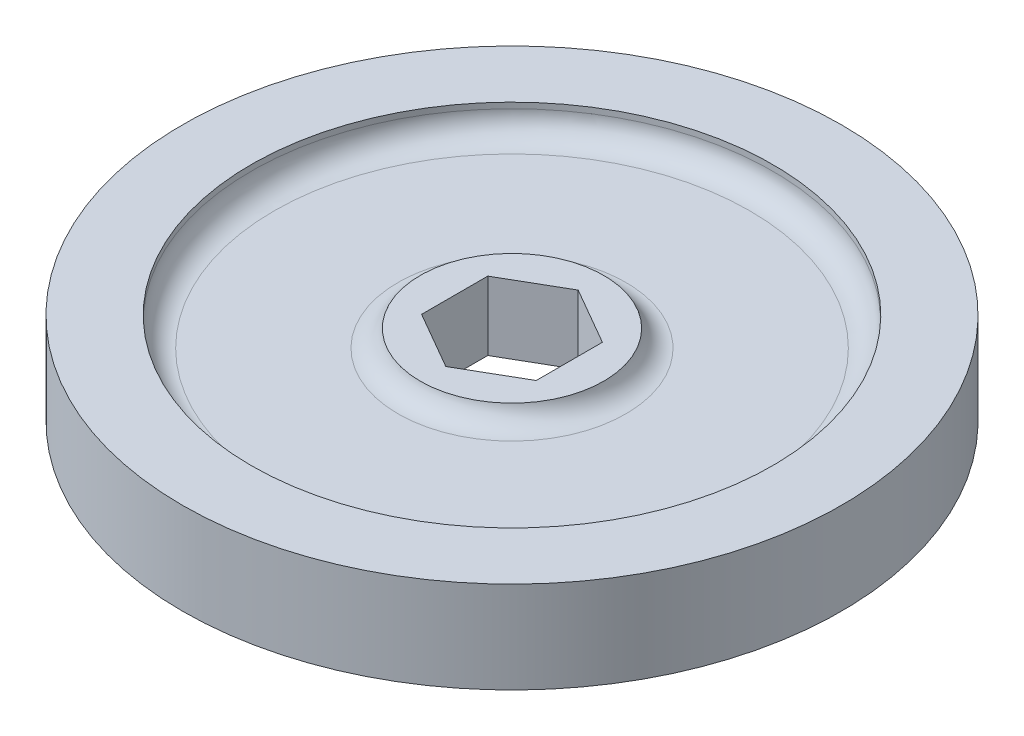
ISO-10303-21;
HEADER;
FILE_DESCRIPTION(('STEP AP214'),'2;1');
FILE_NAME('part.step','',(''),(''),'','','');
FILE_SCHEMA(('AUTOMOTIVE_DESIGN { 1 0 10303 214 1 1 1 1 }'));
ENDSEC;
DATA;
#1=APPLICATION_CONTEXT('core data for automotive mechanical design processes');
#2=APPLICATION_PROTOCOL_DEFINITION('international standard','automotive_design',2000,#1);
#3=PRODUCT_CONTEXT('',#1,'mechanical');
#4=PRODUCT('Part','Part','',(#3));
#5=PRODUCT_RELATED_PRODUCT_CATEGORY('part','',(#4));
#6=PRODUCT_DEFINITION_FORMATION('','',#4);
#7=PRODUCT_DEFINITION_CONTEXT('part definition',#1,'design');
#8=PRODUCT_DEFINITION('design','',#6,#7);
#9=PRODUCT_DEFINITION_SHAPE('','',#8);
#10=(LENGTH_UNIT() NAMED_UNIT(*) SI_UNIT(.MILLI.,.METRE.));
#11=(NAMED_UNIT(*) PLANE_ANGLE_UNIT() SI_UNIT($,.RADIAN.));
#12=(NAMED_UNIT(*) SI_UNIT($,.STERADIAN.) SOLID_ANGLE_UNIT());
#13=UNCERTAINTY_MEASURE_WITH_UNIT(LENGTH_MEASURE(1.E-05),#10,'distance_accuracy_value','');
#14=(GEOMETRIC_REPRESENTATION_CONTEXT(3) GLOBAL_UNCERTAINTY_ASSIGNED_CONTEXT((#13)) GLOBAL_UNIT_ASSIGNED_CONTEXT((#10,
#11,#12)) REPRESENTATION_CONTEXT('',''));
#15=CARTESIAN_POINT('',(0.,0.,0.));
#16=DIRECTION('',(0.,0.,1.));
#17=DIRECTION('',(1.,0.,0.));
#18=AXIS2_PLACEMENT_3D('',#15,#16,#17);
#19=CARTESIAN_POINT('',(3.175,-3.81,-5.49926131403118));
#20=DIRECTION('',(0.5,0.,-0.866025403784439));
#21=DIRECTION('',(-0.866025403784439,0.,-0.5));
#22=AXIS2_PLACEMENT_3D('',#19,#20,#21);
#23=PLANE('',#22);
#24=DIRECTION('',(0.,1.,0.));
#25=VECTOR('',#24,1.);
#26=CARTESIAN_POINT('',(6.34999999999999,-3.81,-3.66617420935413));
#27=LINE('',#26,#25);
#28=CARTESIAN_POINT('',(6.34999999999999,-3.81,-3.66617420935413));
#29=VERTEX_POINT('',#28);
#30=CARTESIAN_POINT('',(6.34999999999999,3.81,-3.66617420935413));
#31=VERTEX_POINT('',#30);
#32=EDGE_CURVE('E85',#29,#31,#27,.T.);
#33=ORIENTED_EDGE('',*,*,#32,.T.);
#34=DIRECTION('',(-0.866025403784439,0.,-0.5));
#35=VECTOR('',#34,1.);
#36=CARTESIAN_POINT('',(3.175,3.81,-5.49926131403118));
#37=LINE('',#36,#35);
#38=CARTESIAN_POINT('',(0.,3.81,-7.33234841870824));
#39=VERTEX_POINT('',#38);
#40=EDGE_CURVE('E88',#31,#39,#37,.T.);
#41=ORIENTED_EDGE('',*,*,#40,.T.);
#42=DIRECTION('',(0.,1.,0.));
#43=VECTOR('',#42,1.);
#44=CARTESIAN_POINT('',(0.,-3.81,-7.33234841870824));
#45=LINE('',#44,#43);
#46=CARTESIAN_POINT('',(0.,-3.81,-7.33234841870824));
#47=VERTEX_POINT('',#46);
#48=EDGE_CURVE('E138',#47,#39,#45,.T.);
#49=ORIENTED_EDGE('',*,*,#48,.F.);
#50=DIRECTION('',(-0.866025403784439,0.,-0.5));
#51=VECTOR('',#50,1.);
#52=CARTESIAN_POINT('',(3.175,-3.81,-5.49926131403118));
#53=LINE('',#52,#51);
#54=EDGE_CURVE('E90',#29,#47,#53,.T.);
#55=ORIENTED_EDGE('',*,*,#54,.F.);
#56=EDGE_LOOP('',(#33,#41,#49,#55));
#57=FACE_BOUND('',#56,.T.);
#58=ADVANCED_FACE('F34',(#57),#23,.F.);
#59=CARTESIAN_POINT('',(-3.175,-3.81,-5.49926131403118));
#60=DIRECTION('',(-0.5,0.,-0.866025403784439));
#61=DIRECTION('',(-0.866025403784439,0.,0.5));
#62=AXIS2_PLACEMENT_3D('',#59,#60,#61);
#63=PLANE('',#62);
#64=ORIENTED_EDGE('',*,*,#48,.T.);
#65=DIRECTION('',(-0.866025403784439,0.,0.5));
#66=VECTOR('',#65,1.);
#67=CARTESIAN_POINT('',(-3.175,3.81,-5.49926131403118));
#68=LINE('',#67,#66);
#69=CARTESIAN_POINT('',(-6.35,3.81,-3.66617420935412));
#70=VERTEX_POINT('',#69);
#71=EDGE_CURVE('E106',#39,#70,#68,.T.);
#72=ORIENTED_EDGE('',*,*,#71,.T.);
#73=DIRECTION('',(0.,1.,0.));
#74=VECTOR('',#73,1.);
#75=CARTESIAN_POINT('',(-6.35,-3.81,-3.66617420935412));
#76=LINE('',#75,#74);
#77=CARTESIAN_POINT('',(-6.35,-3.81,-3.66617420935412));
#78=VERTEX_POINT('',#77);
#79=EDGE_CURVE('E141',#78,#70,#76,.T.);
#80=ORIENTED_EDGE('',*,*,#79,.F.);
#81=DIRECTION('',(-0.866025403784439,0.,0.5));
#82=VECTOR('',#81,1.);
#83=CARTESIAN_POINT('',(-3.175,-3.81,-5.49926131403118));
#84=LINE('',#83,#82);
#85=EDGE_CURVE('E49',#47,#78,#84,.T.);
#86=ORIENTED_EDGE('',*,*,#85,.F.);
#87=EDGE_LOOP('',(#64,#72,#80,#86));
#88=FACE_BOUND('',#87,.T.);
#89=ADVANCED_FACE('F178',(#88),#63,.F.);
#90=CARTESIAN_POINT('',(-6.35,-3.81,0.));
#91=DIRECTION('',(-1.,0.,0.));
#92=DIRECTION('',(0.,0.,1.));
#93=AXIS2_PLACEMENT_3D('',#90,#91,#92);
#94=PLANE('',#93);
#95=ORIENTED_EDGE('',*,*,#79,.T.);
#96=DIRECTION('',(0.,0.,1.));
#97=VECTOR('',#96,1.);
#98=CARTESIAN_POINT('',(-6.35,3.81,0.));
#99=LINE('',#98,#97);
#100=CARTESIAN_POINT('',(-6.35,3.81,3.66617420935412));
#101=VERTEX_POINT('',#100);
#102=EDGE_CURVE('E119',#70,#101,#99,.T.);
#103=ORIENTED_EDGE('',*,*,#102,.T.);
#104=DIRECTION('',(0.,1.,0.));
#105=VECTOR('',#104,1.);
#106=CARTESIAN_POINT('',(-6.35,-3.81,3.66617420935412));
#107=LINE('',#106,#105);
#108=CARTESIAN_POINT('',(-6.35,-3.81,3.66617420935412));
#109=VERTEX_POINT('',#108);
#110=EDGE_CURVE('E143',#109,#101,#107,.T.);
#111=ORIENTED_EDGE('',*,*,#110,.F.);
#112=DIRECTION('',(0.,0.,1.));
#113=VECTOR('',#112,1.);
#114=CARTESIAN_POINT('',(-6.35,-3.81,0.));
#115=LINE('',#114,#113);
#116=EDGE_CURVE('E133',#78,#109,#115,.T.);
#117=ORIENTED_EDGE('',*,*,#116,.F.);
#118=EDGE_LOOP('',(#95,#103,#111,#117));
#119=FACE_BOUND('',#118,.T.);
#120=ADVANCED_FACE('F183',(#119),#94,.F.);
#121=CARTESIAN_POINT('',(-3.175,-3.81,5.49926131403118));
#122=DIRECTION('',(-0.5,0.,0.866025403784438));
#123=DIRECTION('',(0.866025403784438,0.,0.5));
#124=AXIS2_PLACEMENT_3D('',#121,#122,#123);
#125=PLANE('',#124);
#126=ORIENTED_EDGE('',*,*,#110,.T.);
#127=DIRECTION('',(0.866025403784438,0.,0.5));
#128=VECTOR('',#127,1.);
#129=CARTESIAN_POINT('',(-3.175,3.81,5.49926131403118));
#130=LINE('',#129,#128);
#131=CARTESIAN_POINT('',(0.,3.81,7.33234841870824));
#132=VERTEX_POINT('',#131);
#133=EDGE_CURVE('E113',#101,#132,#130,.T.);
#134=ORIENTED_EDGE('',*,*,#133,.T.);
#135=DIRECTION('',(0.,1.,0.));
#136=VECTOR('',#135,1.);
#137=CARTESIAN_POINT('',(0.,-3.81,7.33234841870824));
#138=LINE('',#137,#136);
#139=CARTESIAN_POINT('',(0.,-3.81,7.33234841870824));
#140=VERTEX_POINT('',#139);
#141=EDGE_CURVE('E145',#140,#132,#138,.T.);
#142=ORIENTED_EDGE('',*,*,#141,.F.);
#143=DIRECTION('',(0.866025403784438,0.,0.5));
#144=VECTOR('',#143,1.);
#145=CARTESIAN_POINT('',(-3.175,-3.81,5.49926131403118));
#146=LINE('',#145,#144);
#147=EDGE_CURVE('E131',#109,#140,#146,.T.);
#148=ORIENTED_EDGE('',*,*,#147,.F.);
#149=EDGE_LOOP('',(#126,#134,#142,#148));
#150=FACE_BOUND('',#149,.T.);
#151=ADVANCED_FACE('F247',(#150),#125,.F.);
#152=CARTESIAN_POINT('',(3.175,-3.81,5.49926131403118));
#153=DIRECTION('',(0.5,0.,0.866025403784438));
#154=DIRECTION('',(0.866025403784439,0.,-0.5));
#155=AXIS2_PLACEMENT_3D('',#152,#153,#154);
#156=PLANE('',#155);
#157=ORIENTED_EDGE('',*,*,#141,.T.);
#158=DIRECTION('',(0.866025403784439,0.,-0.5));
#159=VECTOR('',#158,1.);
#160=CARTESIAN_POINT('',(3.175,3.81,5.49926131403118));
#161=LINE('',#160,#159);
#162=CARTESIAN_POINT('',(6.34999999999999,3.81,3.66617420935412));
#163=VERTEX_POINT('',#162);
#164=EDGE_CURVE('E111',#132,#163,#161,.T.);
#165=ORIENTED_EDGE('',*,*,#164,.T.);
#166=DIRECTION('',(0.,1.,0.));
#167=VECTOR('',#166,1.);
#168=CARTESIAN_POINT('',(6.34999999999999,-3.81,3.66617420935412));
#169=LINE('',#168,#167);
#170=CARTESIAN_POINT('',(6.34999999999999,-3.81,3.66617420935412));
#171=VERTEX_POINT('',#170);
#172=EDGE_CURVE('E94',#171,#163,#169,.T.);
#173=ORIENTED_EDGE('',*,*,#172,.F.);
#174=DIRECTION('',(0.866025403784439,0.,-0.5));
#175=VECTOR('',#174,1.);
#176=CARTESIAN_POINT('',(3.175,-3.81,5.49926131403118));
#177=LINE('',#176,#175);
#178=EDGE_CURVE('E129',#140,#171,#177,.T.);
#179=ORIENTED_EDGE('',*,*,#178,.F.);
#180=EDGE_LOOP('',(#157,#165,#173,#179));
#181=FACE_BOUND('',#180,.T.);
#182=ADVANCED_FACE('F250',(#181),#156,.F.);
#183=CARTESIAN_POINT('',(6.34999999999999,-3.81,0.));
#184=DIRECTION('',(1.,0.,0.));
#185=DIRECTION('',(0.,0.,-1.));
#186=AXIS2_PLACEMENT_3D('',#183,#184,#185);
#187=PLANE('',#186);
#188=ORIENTED_EDGE('',*,*,#172,.T.);
#189=DIRECTION('',(0.,0.,-1.));
#190=VECTOR('',#189,1.);
#191=CARTESIAN_POINT('',(6.34999999999999,3.81,0.));
#192=LINE('',#191,#190);
#193=EDGE_CURVE('E102',#163,#31,#192,.T.);
#194=ORIENTED_EDGE('',*,*,#193,.T.);
#195=ORIENTED_EDGE('',*,*,#32,.F.);
#196=DIRECTION('',(0.,0.,-1.));
#197=VECTOR('',#196,1.);
#198=CARTESIAN_POINT('',(6.34999999999999,-3.81,0.));
#199=LINE('',#198,#197);
#200=EDGE_CURVE('E127',#171,#29,#199,.T.);
#201=ORIENTED_EDGE('',*,*,#200,.F.);
#202=EDGE_LOOP('',(#188,#194,#195,#201));
#203=FACE_BOUND('',#202,.T.);
#204=ADVANCED_FACE('F109',(#203),#187,.F.);
#205=CARTESIAN_POINT('',(0.,-3.81,0.));
#206=DIRECTION('',(0.,1.,0.));
#207=DIRECTION('',(0.,0.,1.));
#208=AXIS2_PLACEMENT_3D('',#205,#206,#207);
#209=PLANE('',#208);
#210=ORIENTED_EDGE('',*,*,#54,.T.);
#211=ORIENTED_EDGE('',*,*,#85,.T.);
#212=ORIENTED_EDGE('',*,*,#116,.T.);
#213=ORIENTED_EDGE('',*,*,#147,.T.);
#214=ORIENTED_EDGE('',*,*,#178,.T.);
#215=ORIENTED_EDGE('',*,*,#200,.T.);
#216=EDGE_LOOP('',(#210,#211,#212,#213,#214,#215));
#217=FACE_BOUND('',#216,.T.);
#218=CARTESIAN_POINT('',(0.,-3.81,0.));
#219=DIRECTION('',(0.,1.,0.));
#220=DIRECTION('',(0.,0.,1.));
#221=AXIS2_PLACEMENT_3D('',#218,#219,#220);
#222=CIRCLE('',#221,10.16);
#223=CARTESIAN_POINT('',(0.,-3.81,10.16));
#224=VERTEX_POINT('',#223);
#225=EDGE_CURVE('E95',#224,#224,#222,.T.);
#226=ORIENTED_EDGE('',*,*,#225,.F.);
#227=EDGE_LOOP('',(#226));
#228=FACE_BOUND('',#227,.T.);
#229=ADVANCED_FACE('F242',(#217,#228),#209,.F.);
#230=CARTESIAN_POINT('',(0.,3.81,0.));
#231=DIRECTION('',(0.,1.,0.));
#232=DIRECTION('',(0.,0.,1.));
#233=AXIS2_PLACEMENT_3D('',#230,#231,#232);
#234=PLANE('',#233);
#235=ORIENTED_EDGE('',*,*,#40,.F.);
#236=ORIENTED_EDGE('',*,*,#193,.F.);
#237=ORIENTED_EDGE('',*,*,#164,.F.);
#238=ORIENTED_EDGE('',*,*,#133,.F.);
#239=ORIENTED_EDGE('',*,*,#102,.F.);
#240=ORIENTED_EDGE('',*,*,#71,.F.);
#241=EDGE_LOOP('',(#235,#236,#237,#238,#239,#240));
#242=FACE_BOUND('',#241,.T.);
#243=CARTESIAN_POINT('',(0.,3.81,0.));
#244=DIRECTION('',(0.,1.,0.));
#245=DIRECTION('',(0.,0.,1.));
#246=AXIS2_PLACEMENT_3D('',#243,#244,#245);
#247=CIRCLE('',#246,10.16);
#248=CARTESIAN_POINT('',(0.,3.81,10.16));
#249=VERTEX_POINT('',#248);
#250=EDGE_CURVE('E123',#249,#249,#247,.T.);
#251=ORIENTED_EDGE('',*,*,#250,.T.);
#252=EDGE_LOOP('',(#251));
#253=FACE_BOUND('',#252,.T.);
#254=ADVANCED_FACE('F99',(#242,#253),#234,.T.);
#255=CARTESIAN_POINT('',(0.,-1.905,0.));
#256=DIRECTION('',(0.,1.,0.));
#257=DIRECTION('',(0.,0.,1.));
#258=AXIS2_PLACEMENT_3D('',#255,#256,#257);
#259=PLANE('',#258);
#260=CARTESIAN_POINT('',(0.,-1.905,0.));
#261=DIRECTION('',(0.,1.,0.));
#262=DIRECTION('',(0.,0.,1.));
#263=AXIS2_PLACEMENT_3D('',#260,#261,#262);
#264=CIRCLE('',#263,26.3525);
#265=CARTESIAN_POINT('',(0.,-1.905,26.3525));
#266=VERTEX_POINT('',#265);
#267=EDGE_CURVE('E153',#266,#266,#264,.F.);
#268=ORIENTED_EDGE('',*,*,#267,.T.);
#269=EDGE_LOOP('',(#268));
#270=FACE_BOUND('',#269,.T.);
#271=CARTESIAN_POINT('',(0.,-1.905,0.));
#272=DIRECTION('',(0.,1.,0.));
#273=DIRECTION('',(0.,0.,1.));
#274=AXIS2_PLACEMENT_3D('',#271,#272,#273);
#275=CIRCLE('',#274,12.6193444248417);
#276=CARTESIAN_POINT('',(0.,-1.905,12.6193444248417));
#277=VERTEX_POINT('',#276);
#278=EDGE_CURVE('E150',#277,#277,#275,.T.);
#279=ORIENTED_EDGE('',*,*,#278,.T.);
#280=EDGE_LOOP('',(#279));
#281=FACE_BOUND('',#280,.T.);
#282=ADVANCED_FACE('F236',(#270,#281),#259,.F.);
#283=CARTESIAN_POINT('',(0.,1.905,0.));
#284=DIRECTION('',(0.,1.,0.));
#285=DIRECTION('',(0.,0.,1.));
#286=AXIS2_PLACEMENT_3D('',#283,#284,#285);
#287=PLANE('',#286);
#288=CARTESIAN_POINT('',(0.,1.905,0.));
#289=DIRECTION('',(0.,1.,0.));
#290=DIRECTION('',(0.,0.,1.));
#291=AXIS2_PLACEMENT_3D('',#288,#289,#290);
#292=CIRCLE('',#291,26.3525);
#293=CARTESIAN_POINT('',(0.,1.905,26.3525));
#294=VERTEX_POINT('',#293);
#295=EDGE_CURVE('E42',#294,#294,#292,.T.);
#296=ORIENTED_EDGE('',*,*,#295,.T.);
#297=EDGE_LOOP('',(#296));
#298=FACE_BOUND('',#297,.T.);
#299=CARTESIAN_POINT('',(0.,1.905,0.));
#300=DIRECTION('',(0.,1.,0.));
#301=DIRECTION('',(0.,0.,1.));
#302=AXIS2_PLACEMENT_3D('',#299,#300,#301);
#303=CIRCLE('',#302,12.6193444248417);
#304=CARTESIAN_POINT('',(0.,1.905,12.6193444248417));
#305=VERTEX_POINT('',#304);
#306=EDGE_CURVE('E156',#305,#305,#303,.F.);
#307=ORIENTED_EDGE('',*,*,#306,.T.);
#308=EDGE_LOOP('',(#307));
#309=FACE_BOUND('',#308,.T.);
#310=ADVANCED_FACE('F161',(#298,#309),#287,.T.);
#311=CARTESIAN_POINT('',(0.,-5.08,0.));
#312=DIRECTION('',(0.,1.,0.));
#313=DIRECTION('',(0.,0.,1.));
#314=AXIS2_PLACEMENT_3D('',#311,#312,#313);
#315=CYLINDRICAL_SURFACE('',#314,28.8925);
#316=CARTESIAN_POINT('',(0.,-4.445,0.));
#317=DIRECTION('',(0.,1.,0.));
#318=DIRECTION('',(0.,0.,1.));
#319=AXIS2_PLACEMENT_3D('',#316,#317,#318);
#320=CIRCLE('',#319,28.8925);
#321=CARTESIAN_POINT('',(0.,-4.445,28.8925));
#322=VERTEX_POINT('',#321);
#323=EDGE_CURVE('E140',#322,#322,#320,.T.);
#324=ORIENTED_EDGE('',*,*,#323,.T.);
#325=EDGE_LOOP('',(#324));
#326=FACE_BOUND('',#325,.T.);
#327=CARTESIAN_POINT('',(0.,-5.08,0.));
#328=DIRECTION('',(0.,1.,0.));
#329=DIRECTION('',(0.,0.,1.));
#330=AXIS2_PLACEMENT_3D('',#327,#328,#329);
#331=CIRCLE('',#330,28.8925);
#332=CARTESIAN_POINT('',(0.,-5.08,28.8925));
#333=VERTEX_POINT('',#332);
#334=EDGE_CURVE('E107',#333,#333,#331,.T.);
#335=ORIENTED_EDGE('',*,*,#334,.F.);
#336=EDGE_LOOP('',(#335));
#337=FACE_BOUND('',#336,.T.);
#338=ADVANCED_FACE('F201',(#326,#337),#315,.F.);
#339=CARTESIAN_POINT('',(0.,4.445,0.));
#340=DIRECTION('',(0.,1.,0.));
#341=DIRECTION('',(0.,0.,1.));
#342=AXIS2_PLACEMENT_3D('',#339,#340,#341);
#343=CIRCLE('',#342,28.8925);
#344=CARTESIAN_POINT('',(0.,4.445,28.8925));
#345=VERTEX_POINT('',#344);
#346=EDGE_CURVE('E11',#345,#345,#343,.F.);
#347=ORIENTED_EDGE('',*,*,#346,.T.);
#348=EDGE_LOOP('',(#347));
#349=FACE_BOUND('',#348,.T.);
#350=CARTESIAN_POINT('',(0.,5.08,0.));
#351=DIRECTION('',(0.,1.,0.));
#352=DIRECTION('',(0.,0.,1.));
#353=AXIS2_PLACEMENT_3D('',#350,#351,#352);
#354=CIRCLE('',#353,28.8925);
#355=CARTESIAN_POINT('',(0.,5.08,28.8925));
#356=VERTEX_POINT('',#355);
#357=EDGE_CURVE('E209',#356,#356,#354,.T.);
#358=ORIENTED_EDGE('',*,*,#357,.T.);
#359=EDGE_LOOP('',(#358));
#360=FACE_BOUND('',#359,.T.);
#361=ADVANCED_FACE('F204',(#349,#360),#315,.F.);
#362=CARTESIAN_POINT('',(0.,-5.08,0.));
#363=DIRECTION('',(0.,1.,0.));
#364=DIRECTION('',(0.,0.,1.));
#365=AXIS2_PLACEMENT_3D('',#362,#363,#364);
#366=PLANE('',#365);
#367=ORIENTED_EDGE('',*,*,#334,.T.);
#368=EDGE_LOOP('',(#367));
#369=FACE_BOUND('',#368,.T.);
#370=CARTESIAN_POINT('',(0.,-5.08,0.));
#371=DIRECTION('',(0.,1.,0.));
#372=DIRECTION('',(0.,0.,1.));
#373=AXIS2_PLACEMENT_3D('',#370,#371,#372);
#374=CIRCLE('',#373,36.5125);
#375=CARTESIAN_POINT('',(0.,-5.08,36.5125));
#376=VERTEX_POINT('',#375);
#377=EDGE_CURVE('E211',#376,#376,#374,.T.);
#378=ORIENTED_EDGE('',*,*,#377,.F.);
#379=EDGE_LOOP('',(#378));
#380=FACE_BOUND('',#379,.T.);
#381=ADVANCED_FACE('F222',(#369,#380),#366,.F.);
#382=CARTESIAN_POINT('',(0.,5.08,0.));
#383=DIRECTION('',(0.,1.,0.));
#384=DIRECTION('',(0.,0.,1.));
#385=AXIS2_PLACEMENT_3D('',#382,#383,#384);
#386=PLANE('',#385);
#387=ORIENTED_EDGE('',*,*,#357,.F.);
#388=EDGE_LOOP('',(#387));
#389=FACE_BOUND('',#388,.T.);
#390=CARTESIAN_POINT('',(0.,5.08,0.));
#391=DIRECTION('',(0.,1.,0.));
#392=DIRECTION('',(0.,0.,1.));
#393=AXIS2_PLACEMENT_3D('',#390,#391,#392);
#394=CIRCLE('',#393,36.5125);
#395=CARTESIAN_POINT('',(0.,5.08,36.5125));
#396=VERTEX_POINT('',#395);
#397=EDGE_CURVE('E216',#396,#396,#394,.T.);
#398=ORIENTED_EDGE('',*,*,#397,.T.);
#399=EDGE_LOOP('',(#398));
#400=FACE_BOUND('',#399,.T.);
#401=ADVANCED_FACE('F194',(#389,#400),#386,.T.);
#402=CARTESIAN_POINT('',(0.,-5.08,0.));
#403=DIRECTION('',(0.,1.,0.));
#404=DIRECTION('',(0.,0.,1.));
#405=AXIS2_PLACEMENT_3D('',#402,#403,#404);
#406=CYLINDRICAL_SURFACE('',#405,36.5125);
#407=ORIENTED_EDGE('',*,*,#377,.T.);
#408=EDGE_LOOP('',(#407));
#409=FACE_BOUND('',#408,.T.);
#410=ORIENTED_EDGE('',*,*,#397,.F.);
#411=EDGE_LOOP('',(#410));
#412=FACE_BOUND('',#411,.T.);
#413=ADVANCED_FACE('F189',(#409,#412),#406,.T.);
#414=CARTESIAN_POINT('',(0.,-4.445,0.));
#415=DIRECTION('',(0.,1.,0.));
#416=DIRECTION('',(0.,0.,1.));
#417=AXIS2_PLACEMENT_3D('',#414,#415,#416);
#418=TOROIDAL_SURFACE('',#417,26.3525,2.54);
#419=ORIENTED_EDGE('',*,*,#267,.F.);
#420=EDGE_LOOP('',(#419));
#421=FACE_BOUND('',#420,.T.);
#422=ORIENTED_EDGE('',*,*,#323,.F.);
#423=EDGE_LOOP('',(#422));
#424=FACE_BOUND('',#423,.T.);
#425=ADVANCED_FACE('F173',(#421,#424),#418,.F.);
#426=CARTESIAN_POINT('',(0.,-4.445,0.));
#427=DIRECTION('',(0.,1.,0.));
#428=DIRECTION('',(0.,0.,1.));
#429=AXIS2_PLACEMENT_3D('',#426,#427,#428);
#430=TOROIDAL_SURFACE('',#429,12.6193444248417,2.54);
#431=ORIENTED_EDGE('',*,*,#225,.T.);
#432=EDGE_LOOP('',(#431));
#433=FACE_BOUND('',#432,.T.);
#434=ORIENTED_EDGE('',*,*,#278,.F.);
#435=EDGE_LOOP('',(#434));
#436=FACE_BOUND('',#435,.T.);
#437=ADVANCED_FACE('F166',(#433,#436),#430,.F.);
#438=CARTESIAN_POINT('',(0.,4.445,0.));
#439=DIRECTION('',(0.,1.,0.));
#440=DIRECTION('',(0.,0.,1.));
#441=AXIS2_PLACEMENT_3D('',#438,#439,#440);
#442=TOROIDAL_SURFACE('',#441,26.3525,2.54);
#443=ORIENTED_EDGE('',*,*,#346,.F.);
#444=EDGE_LOOP('',(#443));
#445=FACE_BOUND('',#444,.T.);
#446=ORIENTED_EDGE('',*,*,#295,.F.);
#447=EDGE_LOOP('',(#446));
#448=FACE_BOUND('',#447,.T.);
#449=ADVANCED_FACE('F164',(#445,#448),#442,.F.);
#450=CARTESIAN_POINT('',(0.,4.445,0.));
#451=DIRECTION('',(0.,1.,0.));
#452=DIRECTION('',(0.,0.,1.));
#453=AXIS2_PLACEMENT_3D('',#450,#451,#452);
#454=TOROIDAL_SURFACE('',#453,12.6193444248417,2.54);
#455=ORIENTED_EDGE('',*,*,#250,.F.);
#456=EDGE_LOOP('',(#455));
#457=FACE_BOUND('',#456,.T.);
#458=ORIENTED_EDGE('',*,*,#306,.F.);
#459=EDGE_LOOP('',(#458));
#460=FACE_BOUND('',#459,.T.);
#461=ADVANCED_FACE('F36',(#457,#460),#454,.F.);
#462=CLOSED_SHELL('',(#58,#89,#120,#151,#182,#204,#229,#254,#282,#310,#338,#361,#381,#401,#413,
#425,#437,#449,#461));
#463=MANIFOLD_SOLID_BREP('B2',#462);
#464=ADVANCED_BREP_SHAPE_REPRESENTATION('',(#18,#463),#14);
#465=SHAPE_DEFINITION_REPRESENTATION(#9,#464);
ENDSEC;
END-ISO-10303-21;
